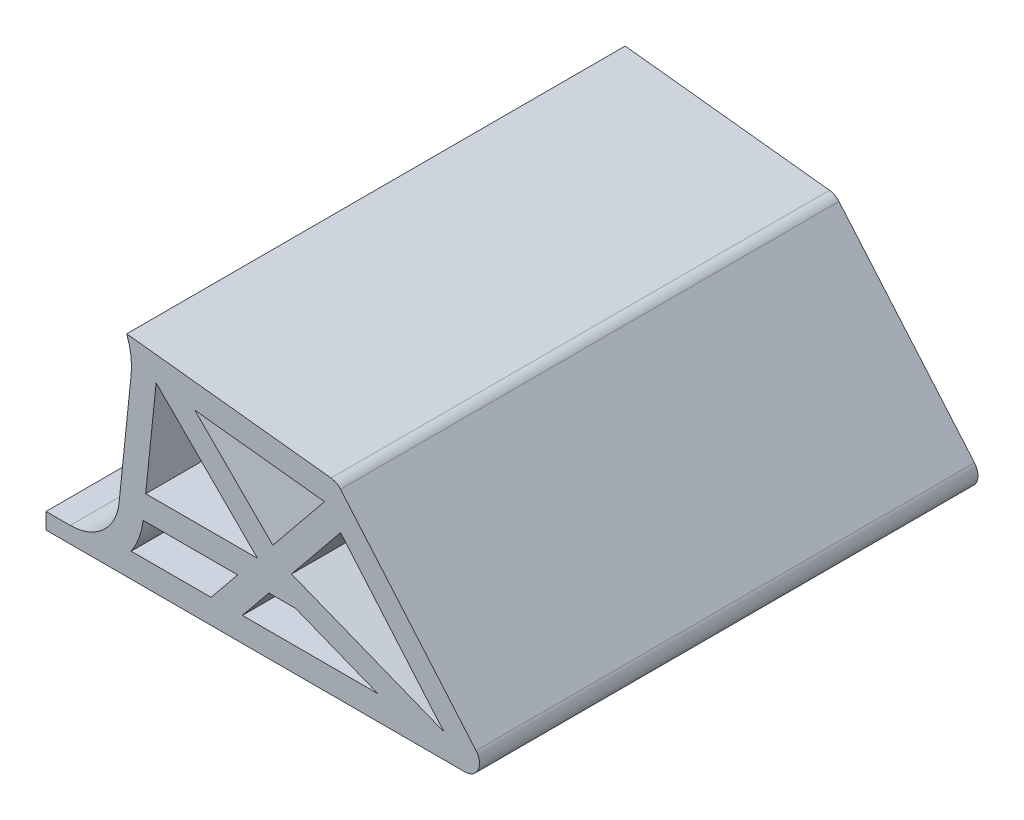
ISO-10303-21;
HEADER;
FILE_DESCRIPTION(('STEP AP214'),'2;1');
FILE_NAME('part.step','',(''),(''),'','','');
FILE_SCHEMA(('AUTOMOTIVE_DESIGN { 1 0 10303 214 1 1 1 1 }'));
ENDSEC;
DATA;
#1=APPLICATION_CONTEXT('core data for automotive mechanical design processes');
#2=APPLICATION_PROTOCOL_DEFINITION('international standard','automotive_design',2000,#1);
#3=PRODUCT_CONTEXT('',#1,'mechanical');
#4=PRODUCT('Part','Part','',(#3));
#5=PRODUCT_RELATED_PRODUCT_CATEGORY('part','',(#4));
#6=PRODUCT_DEFINITION_FORMATION('','',#4);
#7=PRODUCT_DEFINITION_CONTEXT('part definition',#1,'design');
#8=PRODUCT_DEFINITION('design','',#6,#7);
#9=PRODUCT_DEFINITION_SHAPE('','',#8);
#10=(LENGTH_UNIT() NAMED_UNIT(*) SI_UNIT(.MILLI.,.METRE.));
#11=(NAMED_UNIT(*) PLANE_ANGLE_UNIT() SI_UNIT($,.RADIAN.));
#12=(NAMED_UNIT(*) SI_UNIT($,.STERADIAN.) SOLID_ANGLE_UNIT());
#13=UNCERTAINTY_MEASURE_WITH_UNIT(LENGTH_MEASURE(1.E-05),#10,'distance_accuracy_value','');
#14=(GEOMETRIC_REPRESENTATION_CONTEXT(3) GLOBAL_UNCERTAINTY_ASSIGNED_CONTEXT((#13)) GLOBAL_UNIT_ASSIGNED_CONTEXT((#10,
#11,#12)) REPRESENTATION_CONTEXT('',''));
#15=CARTESIAN_POINT('',(0.,0.,0.));
#16=DIRECTION('',(0.,0.,1.));
#17=DIRECTION('',(1.,0.,0.));
#18=AXIS2_PLACEMENT_3D('',#15,#16,#17);
#19=CARTESIAN_POINT('',(65.028024959865,20.2989752880155,-51.31));
#20=DIRECTION('',(-0.994726056337949,0.102567406335303,0.));
#21=DIRECTION('',(-0.102567406335303,-0.994726056337949,0.));
#22=AXIS2_PLACEMENT_3D('',#19,#20,#21);
#23=PLANE('',#22);
#24=DIRECTION('',(0.,0.,1.));
#25=VECTOR('',#24,1.);
#26=CARTESIAN_POINT('',(62.8777569998753,-0.554896758997451,-51.31));
#27=LINE('',#26,#25);
#28=CARTESIAN_POINT('',(62.8777569998753,-0.554896758997451,-51.31));
#29=VERTEX_POINT('',#28);
#30=CARTESIAN_POINT('',(62.8777569998753,-0.55489675899745,51.31));
#31=VERTEX_POINT('',#30);
#32=EDGE_CURVE('E250',#29,#31,#27,.T.);
#33=ORIENTED_EDGE('',*,*,#32,.F.);
#34=DIRECTION('',(-0.102567406335303,-0.994726056337949,0.));
#35=VECTOR('',#34,1.);
#36=CARTESIAN_POINT('',(65.028024959865,20.2989752880155,-51.31));
#37=LINE('',#36,#35);
#38=CARTESIAN_POINT('',(65.028024959865,20.2989752880155,-51.31));
#39=VERTEX_POINT('',#38);
#40=EDGE_CURVE('E436',#39,#29,#37,.T.);
#41=ORIENTED_EDGE('',*,*,#40,.F.);
#42=DIRECTION('',(0.,0.,1.));
#43=VECTOR('',#42,1.);
#44=CARTESIAN_POINT('',(65.028024959865,20.2989752880155,-51.31));
#45=LINE('',#44,#43);
#46=CARTESIAN_POINT('',(65.028024959865,20.2989752880155,51.31));
#47=VERTEX_POINT('',#46);
#48=EDGE_CURVE('E419',#39,#47,#45,.T.);
#49=ORIENTED_EDGE('',*,*,#48,.T.);
#50=DIRECTION('',(-0.102567406335303,-0.994726056337949,0.));
#51=VECTOR('',#50,1.);
#52=CARTESIAN_POINT('',(65.028024959865,20.2989752880155,51.31));
#53=LINE('',#52,#51);
#54=EDGE_CURVE('E475',#47,#31,#53,.T.);
#55=ORIENTED_EDGE('',*,*,#54,.T.);
#56=EDGE_LOOP('',(#33,#41,#49,#55));
#57=FACE_BOUND('',#56,.T.);
#58=ADVANCED_FACE('F241',(#57),#23,.F.);
#59=CARTESIAN_POINT('',(59.8862344106623,-12.2938676792946,-51.31));
#60=DIRECTION('',(0.,-1.,0.));
#61=DIRECTION('',(1.,0.,0.));
#62=AXIS2_PLACEMENT_3D('',#59,#60,#61);
#63=PLANE('',#62);
#64=DIRECTION('',(0.,0.,-1.));
#65=VECTOR('',#64,1.);
#66=CARTESIAN_POINT('',(76.3374642279556,-12.2938676792946,99.4017159834064));
#67=LINE('',#66,#65);
#68=CARTESIAN_POINT('',(76.3374642279556,-12.2938676792946,51.31));
#69=VERTEX_POINT('',#68);
#70=CARTESIAN_POINT('',(76.3374642279556,-12.2938676792946,-51.31));
#71=VERTEX_POINT('',#70);
#72=EDGE_CURVE('E462',#69,#71,#67,.T.);
#73=ORIENTED_EDGE('',*,*,#72,.T.);
#74=DIRECTION('',(1.,0.,0.));
#75=VECTOR('',#74,1.);
#76=CARTESIAN_POINT('',(59.8862344106623,-12.2938676792946,-51.31));
#77=LINE('',#76,#75);
#78=CARTESIAN_POINT('',(59.8862344106623,-12.2938676792946,-51.31));
#79=VERTEX_POINT('',#78);
#80=EDGE_CURVE('E677',#79,#71,#77,.T.);
#81=ORIENTED_EDGE('',*,*,#80,.F.);
#82=DIRECTION('',(0.,0.,1.));
#83=VECTOR('',#82,1.);
#84=CARTESIAN_POINT('',(59.8862344106623,-12.2938676792946,-51.31));
#85=LINE('',#84,#83);
#86=CARTESIAN_POINT('',(59.8862344106623,-12.2938676792946,51.31));
#87=VERTEX_POINT('',#86);
#88=EDGE_CURVE('E445',#79,#87,#85,.T.);
#89=ORIENTED_EDGE('',*,*,#88,.T.);
#90=DIRECTION('',(1.,0.,0.));
#91=VECTOR('',#90,1.);
#92=CARTESIAN_POINT('',(59.8862344106623,-12.2938676792946,51.31));
#93=LINE('',#92,#91);
#94=EDGE_CURVE('E463',#87,#69,#93,.T.);
#95=ORIENTED_EDGE('',*,*,#94,.T.);
#96=EDGE_LOOP('',(#73,#81,#89,#95));
#97=FACE_BOUND('',#96,.T.);
#98=ADVANCED_FACE('F713',(#97),#63,.F.);
#99=CARTESIAN_POINT('',(47.3561523220938,-3.86729999999991,51.31));
#100=DIRECTION('',(0.,0.,-1.));
#101=DIRECTION('',(-1.,0.,0.));
#102=AXIS2_PLACEMENT_3D('',#99,#100,#101);
#103=CYLINDRICAL_SURFACE('',#102,10.1);
#104=CARTESIAN_POINT('',(47.3561523220938,-3.86729999999991,-51.31));
#105=DIRECTION('',(0.,0.,-1.));
#106=DIRECTION('',(1.,0.,0.));
#107=AXIS2_PLACEMENT_3D('',#104,#105,#106);
#108=CIRCLE('',#107,10.1);
#109=CARTESIAN_POINT('',(57.4028854911071,-4.90323080398647,-51.31));
#110=VERTEX_POINT('',#109);
#111=CARTESIAN_POINT('',(47.3561523220938,-13.9672999999999,-51.31));
#112=VERTEX_POINT('',#111);
#113=EDGE_CURVE('E429',#110,#112,#108,.T.);
#114=ORIENTED_EDGE('',*,*,#113,.T.);
#115=DIRECTION('',(0.,0.,-1.));
#116=VECTOR('',#115,1.);
#117=CARTESIAN_POINT('',(47.3561523220938,-13.9672999999999,51.31));
#118=LINE('',#117,#116);
#119=CARTESIAN_POINT('',(47.3561523220938,-13.9672999999999,51.31));
#120=VERTEX_POINT('',#119);
#121=EDGE_CURVE('E581',#120,#112,#118,.T.);
#122=ORIENTED_EDGE('',*,*,#121,.F.);
#123=CARTESIAN_POINT('',(47.3561523220938,-3.86729999999991,51.31));
#124=DIRECTION('',(0.,0.,-1.));
#125=DIRECTION('',(1.,0.,0.));
#126=AXIS2_PLACEMENT_3D('',#123,#124,#125);
#127=CIRCLE('',#126,10.1);
#128=CARTESIAN_POINT('',(57.4028854911071,-4.90323080398647,51.31));
#129=VERTEX_POINT('',#128);
#130=EDGE_CURVE('E484',#129,#120,#127,.T.);
#131=ORIENTED_EDGE('',*,*,#130,.F.);
#132=DIRECTION('',(0.,0.,-1.));
#133=VECTOR('',#132,1.);
#134=CARTESIAN_POINT('',(57.4028854911071,-4.90323080398647,51.31));
#135=LINE('',#134,#133);
#136=EDGE_CURVE('E516',#129,#110,#135,.T.);
#137=ORIENTED_EDGE('',*,*,#136,.T.);
#138=EDGE_LOOP('',(#114,#122,#131,#137));
#139=FACE_BOUND('',#138,.T.);
#140=ADVANCED_FACE('F243',(#139),#103,.F.);
#141=CARTESIAN_POINT('',(47.3561523220938,-13.9672999999999,51.31));
#142=DIRECTION('',(0.,-1.,0.));
#143=DIRECTION('',(0.,0.,-1.));
#144=AXIS2_PLACEMENT_3D('',#141,#142,#143);
#145=PLANE('',#144);
#146=DIRECTION('',(-1.,0.,0.));
#147=VECTOR('',#146,1.);
#148=CARTESIAN_POINT('',(47.3561523220938,-13.9672999999999,-51.31));
#149=LINE('',#148,#147);
#150=CARTESIAN_POINT('',(42.3561523220938,-13.9672999999999,-51.31));
#151=VERTEX_POINT('',#150);
#152=EDGE_CURVE('E520',#112,#151,#149,.T.);
#153=ORIENTED_EDGE('',*,*,#152,.T.);
#154=DIRECTION('',(0.,0.,-1.));
#155=VECTOR('',#154,1.);
#156=CARTESIAN_POINT('',(42.3561523220938,-13.9672999999999,51.31));
#157=LINE('',#156,#155);
#158=CARTESIAN_POINT('',(42.3561523220938,-13.9672999999999,51.31));
#159=VERTEX_POINT('',#158);
#160=EDGE_CURVE('E577',#159,#151,#157,.T.);
#161=ORIENTED_EDGE('',*,*,#160,.F.);
#162=DIRECTION('',(-1.,0.,0.));
#163=VECTOR('',#162,1.);
#164=CARTESIAN_POINT('',(47.3561523220938,-13.9672999999999,51.31));
#165=LINE('',#164,#163);
#166=EDGE_CURVE('E488',#120,#159,#165,.T.);
#167=ORIENTED_EDGE('',*,*,#166,.F.);
#168=ORIENTED_EDGE('',*,*,#121,.T.);
#169=EDGE_LOOP('',(#153,#161,#167,#168));
#170=FACE_BOUND('',#169,.T.);
#171=ADVANCED_FACE('F771',(#170),#145,.F.);
#172=CARTESIAN_POINT('',(42.3561523220938,-17.2938676792946,51.31));
#173=DIRECTION('',(1.,0.,0.));
#174=DIRECTION('',(0.,0.,-1.));
#175=AXIS2_PLACEMENT_3D('',#172,#173,#174);
#176=PLANE('',#175);
#177=DIRECTION('',(0.,-1.,0.));
#178=VECTOR('',#177,1.);
#179=CARTESIAN_POINT('',(42.3561523220938,-17.2938676792946,-51.31));
#180=LINE('',#179,#178);
#181=CARTESIAN_POINT('',(42.3561523220938,-17.2938676792946,-51.31));
#182=VERTEX_POINT('',#181);
#183=EDGE_CURVE('E523',#151,#182,#180,.T.);
#184=ORIENTED_EDGE('',*,*,#183,.T.);
#185=DIRECTION('',(0.,0.,-1.));
#186=VECTOR('',#185,1.);
#187=CARTESIAN_POINT('',(42.3561523220938,-17.2938676792946,51.31));
#188=LINE('',#187,#186);
#189=CARTESIAN_POINT('',(42.3561523220938,-17.2938676792946,51.31));
#190=VERTEX_POINT('',#189);
#191=EDGE_CURVE('E573',#190,#182,#188,.T.);
#192=ORIENTED_EDGE('',*,*,#191,.F.);
#193=DIRECTION('',(0.,-1.,0.));
#194=VECTOR('',#193,1.);
#195=CARTESIAN_POINT('',(42.3561523220938,-17.2938676792946,51.31));
#196=LINE('',#195,#194);
#197=EDGE_CURVE('E492',#159,#190,#196,.T.);
#198=ORIENTED_EDGE('',*,*,#197,.F.);
#199=ORIENTED_EDGE('',*,*,#160,.T.);
#200=EDGE_LOOP('',(#184,#192,#198,#199));
#201=FACE_BOUND('',#200,.T.);
#202=ADVANCED_FACE('F768',(#201),#176,.F.);
#203=CARTESIAN_POINT('',(42.3561523220938,-17.2938676792946,51.31));
#204=DIRECTION('',(0.,1.,0.));
#205=DIRECTION('',(0.,0.,1.));
#206=AXIS2_PLACEMENT_3D('',#203,#204,#205);
#207=PLANE('',#206);
#208=DIRECTION('',(1.,0.,0.));
#209=VECTOR('',#208,1.);
#210=CARTESIAN_POINT('',(42.3561523220938,-17.2938676792946,-51.31));
#211=LINE('',#210,#209);
#212=CARTESIAN_POINT('',(128.611229128184,-17.2938676792946,-51.31));
#213=VERTEX_POINT('',#212);
#214=EDGE_CURVE('E526',#182,#213,#211,.T.);
#215=ORIENTED_EDGE('',*,*,#214,.T.);
#216=DIRECTION('',(0.,0.,-1.));
#217=VECTOR('',#216,1.);
#218=CARTESIAN_POINT('',(128.611229128184,-17.2938676792946,51.31));
#219=LINE('',#218,#217);
#220=CARTESIAN_POINT('',(128.611229128184,-17.2938676792946,51.31));
#221=VERTEX_POINT('',#220);
#222=EDGE_CURVE('E569',#221,#213,#219,.T.);
#223=ORIENTED_EDGE('',*,*,#222,.F.);
#224=DIRECTION('',(1.,0.,0.));
#225=VECTOR('',#224,1.);
#226=CARTESIAN_POINT('',(42.3561523220938,-17.2938676792946,51.31));
#227=LINE('',#226,#225);
#228=EDGE_CURVE('E495',#190,#221,#227,.T.);
#229=ORIENTED_EDGE('',*,*,#228,.F.);
#230=ORIENTED_EDGE('',*,*,#191,.T.);
#231=EDGE_LOOP('',(#215,#223,#229,#230));
#232=FACE_BOUND('',#231,.T.);
#233=ADVANCED_FACE('F764',(#232),#207,.F.);
#234=CARTESIAN_POINT('',(128.611229128184,-14.2938676792946,51.31));
#235=DIRECTION('',(0.,0.,-1.));
#236=DIRECTION('',(-1.,0.,0.));
#237=AXIS2_PLACEMENT_3D('',#234,#235,#236);
#238=CYLINDRICAL_SURFACE('',#237,3.);
#239=CARTESIAN_POINT('',(128.611229128184,-14.2938676792946,-51.31));
#240=DIRECTION('',(0.,0.,1.));
#241=DIRECTION('',(1.,0.,0.));
#242=AXIS2_PLACEMENT_3D('',#239,#240,#241);
#243=CIRCLE('',#242,3.);
#244=CARTESIAN_POINT('',(130.891584134114,-12.3445136716982,-51.31));
#245=VERTEX_POINT('',#244);
#246=EDGE_CURVE('E529',#213,#245,#243,.T.);
#247=ORIENTED_EDGE('',*,*,#246,.T.);
#248=DIRECTION('',(0.,0.,-1.));
#249=VECTOR('',#248,1.);
#250=CARTESIAN_POINT('',(130.891584134114,-12.3445136716982,51.31));
#251=LINE('',#250,#249);
#252=CARTESIAN_POINT('',(130.891584134114,-12.3445136716982,51.31));
#253=VERTEX_POINT('',#252);
#254=EDGE_CURVE('E565',#253,#245,#251,.T.);
#255=ORIENTED_EDGE('',*,*,#254,.F.);
#256=CARTESIAN_POINT('',(128.611229128184,-14.2938676792946,51.31));
#257=DIRECTION('',(0.,0.,1.));
#258=DIRECTION('',(1.,0.,0.));
#259=AXIS2_PLACEMENT_3D('',#256,#257,#258);
#260=CIRCLE('',#259,3.);
#261=EDGE_CURVE('E498',#221,#253,#260,.T.);
#262=ORIENTED_EDGE('',*,*,#261,.F.);
#263=ORIENTED_EDGE('',*,*,#222,.T.);
#264=EDGE_LOOP('',(#247,#255,#262,#263));
#265=FACE_BOUND('',#264,.T.);
#266=ADVANCED_FACE('F760',(#265),#238,.T.);
#267=CARTESIAN_POINT('',(130.891584134114,-12.3445136716982,51.31));
#268=DIRECTION('',(-0.760118335309846,-0.649784669198795,0.));
#269=DIRECTION('',(0.649784669198795,-0.760118335309847,0.));
#270=AXIS2_PLACEMENT_3D('',#267,#268,#269);
#271=PLANE('',#270);
#272=DIRECTION('',(-0.649784669198795,0.760118335309846,0.));
#273=VECTOR('',#272,1.);
#274=CARTESIAN_POINT('',(130.891584134114,-12.3445136716982,-51.31));
#275=LINE('',#274,#273);
#276=CARTESIAN_POINT('',(102.99035500593,20.2943540075963,-51.31));
#277=VERTEX_POINT('',#276);
#278=EDGE_CURVE('E532',#245,#277,#275,.T.);
#279=ORIENTED_EDGE('',*,*,#278,.T.);
#280=DIRECTION('',(0.,0.,-1.));
#281=VECTOR('',#280,1.);
#282=CARTESIAN_POINT('',(102.99035500593,20.2943540075963,51.31));
#283=LINE('',#282,#281);
#284=CARTESIAN_POINT('',(102.99035500593,20.2943540075963,51.31));
#285=VERTEX_POINT('',#284);
#286=EDGE_CURVE('E561',#285,#277,#283,.T.);
#287=ORIENTED_EDGE('',*,*,#286,.F.);
#288=DIRECTION('',(-0.649784669198795,0.760118335309846,0.));
#289=VECTOR('',#288,1.);
#290=CARTESIAN_POINT('',(130.891584134114,-12.3445136716982,51.31));
#291=LINE('',#290,#289);
#292=EDGE_CURVE('E501',#253,#285,#291,.T.);
#293=ORIENTED_EDGE('',*,*,#292,.F.);
#294=ORIENTED_EDGE('',*,*,#254,.T.);
#295=EDGE_LOOP('',(#279,#287,#293,#294));
#296=FACE_BOUND('',#295,.T.);
#297=ADVANCED_FACE('F756',(#296),#271,.F.);
#298=CARTESIAN_POINT('',(100.71,18.345,51.31));
#299=DIRECTION('',(0.,0.,-1.));
#300=DIRECTION('',(-1.,0.,0.));
#301=AXIS2_PLACEMENT_3D('',#298,#299,#300);
#302=CYLINDRICAL_SURFACE('',#301,3.00000000000006);
#303=CARTESIAN_POINT('',(100.71,18.345,-51.31));
#304=DIRECTION('',(0.,0.,1.));
#305=DIRECTION('',(1.,0.,0.));
#306=AXIS2_PLACEMENT_3D('',#303,#304,#305);
#307=CIRCLE('',#306,3.00000000000006);
#308=CARTESIAN_POINT('',(101.041429063357,21.3266362581579,-51.31));
#309=VERTEX_POINT('',#308);
#310=EDGE_CURVE('E535',#277,#309,#307,.T.);
#311=ORIENTED_EDGE('',*,*,#310,.T.);
#312=DIRECTION('',(0.,0.,-1.));
#313=VECTOR('',#312,1.);
#314=CARTESIAN_POINT('',(101.041429063357,21.3266362581579,51.31));
#315=LINE('',#314,#313);
#316=CARTESIAN_POINT('',(101.041429063357,21.3266362581579,51.31));
#317=VERTEX_POINT('',#316);
#318=EDGE_CURVE('E557',#317,#309,#315,.T.);
#319=ORIENTED_EDGE('',*,*,#318,.F.);
#320=CARTESIAN_POINT('',(100.71,18.345,51.31));
#321=DIRECTION('',(0.,0.,1.));
#322=DIRECTION('',(1.,0.,0.));
#323=AXIS2_PLACEMENT_3D('',#320,#321,#322);
#324=CIRCLE('',#323,3.00000000000006);
#325=EDGE_CURVE('E504',#285,#317,#324,.T.);
#326=ORIENTED_EDGE('',*,*,#325,.F.);
#327=ORIENTED_EDGE('',*,*,#286,.T.);
#328=EDGE_LOOP('',(#311,#319,#326,#327));
#329=FACE_BOUND('',#328,.T.);
#330=ADVANCED_FACE('F752',(#329),#302,.T.);
#331=CARTESIAN_POINT('',(58.9698937655127,26.003172337842,51.31));
#332=DIRECTION('',(-0.110476354452445,-0.993878752719313,0.));
#333=DIRECTION('',(0.993878752719313,-0.110476354452445,0.));
#334=AXIS2_PLACEMENT_3D('',#331,#332,#333);
#335=PLANE('',#334);
#336=DIRECTION('',(-0.993878752719313,0.110476354452445,0.));
#337=VECTOR('',#336,1.);
#338=CARTESIAN_POINT('',(58.9698937655127,26.003172337842,-51.31));
#339=LINE('',#338,#337);
#340=CARTESIAN_POINT('',(58.9698937655127,26.003172337842,-51.31));
#341=VERTEX_POINT('',#340);
#342=EDGE_CURVE('E538',#309,#341,#339,.T.);
#343=ORIENTED_EDGE('',*,*,#342,.T.);
#344=DIRECTION('',(0.,0.,-1.));
#345=VECTOR('',#344,1.);
#346=CARTESIAN_POINT('',(58.9698937655127,26.003172337842,51.31));
#347=LINE('',#346,#345);
#348=CARTESIAN_POINT('',(58.9698937655127,26.003172337842,51.31));
#349=VERTEX_POINT('',#348);
#350=EDGE_CURVE('E553',#349,#341,#347,.T.);
#351=ORIENTED_EDGE('',*,*,#350,.F.);
#352=DIRECTION('',(-0.993878752719313,0.110476354452445,0.));
#353=VECTOR('',#352,1.);
#354=CARTESIAN_POINT('',(58.9698937655127,26.003172337842,51.31));
#355=LINE('',#354,#353);
#356=EDGE_CURVE('E507',#317,#349,#355,.T.);
#357=ORIENTED_EDGE('',*,*,#356,.F.);
#358=ORIENTED_EDGE('',*,*,#318,.T.);
#359=EDGE_LOOP('',(#343,#351,#357,#358));
#360=FACE_BOUND('',#359,.T.);
#361=ADVANCED_FACE('F748',(#360),#335,.F.);
#362=CARTESIAN_POINT('',(44.8561523220938,20.6354630994126,51.31));
#363=DIRECTION('',(0.,0.,-1.));
#364=DIRECTION('',(-1.,0.,0.));
#365=AXIS2_PLACEMENT_3D('',#362,#363,#364);
#366=CYLINDRICAL_SURFACE('',#365,15.1);
#367=CARTESIAN_POINT('',(44.8561523220938,20.6354630994126,-51.31));
#368=DIRECTION('',(0.,0.,-1.));
#369=DIRECTION('',(1.,0.,0.));
#370=AXIS2_PLACEMENT_3D('',#367,#368,#369);
#371=CIRCLE('',#370,15.1);
#372=CARTESIAN_POINT('',(59.8765157727968,19.0866952637495,-51.31));
#373=VERTEX_POINT('',#372);
#374=EDGE_CURVE('E541',#341,#373,#371,.T.);
#375=ORIENTED_EDGE('',*,*,#374,.T.);
#376=DIRECTION('',(0.,0.,-1.));
#377=VECTOR('',#376,1.);
#378=CARTESIAN_POINT('',(59.8765157727968,19.0866952637495,51.31));
#379=LINE('',#378,#377);
#380=CARTESIAN_POINT('',(59.8765157727968,19.0866952637495,51.31));
#381=VERTEX_POINT('',#380);
#382=EDGE_CURVE('E549',#381,#373,#379,.T.);
#383=ORIENTED_EDGE('',*,*,#382,.F.);
#384=CARTESIAN_POINT('',(44.8561523220938,20.6354630994126,51.31));
#385=DIRECTION('',(0.,0.,-1.));
#386=DIRECTION('',(1.,0.,0.));
#387=AXIS2_PLACEMENT_3D('',#384,#385,#386);
#388=CIRCLE('',#387,15.1);
#389=EDGE_CURVE('E510',#349,#381,#388,.T.);
#390=ORIENTED_EDGE('',*,*,#389,.F.);
#391=ORIENTED_EDGE('',*,*,#350,.T.);
#392=EDGE_LOOP('',(#375,#383,#390,#391));
#393=FACE_BOUND('',#392,.T.);
#394=ADVANCED_FACE('F744',(#393),#366,.F.);
#395=CARTESIAN_POINT('',(59.8765157727968,19.0866952637495,51.31));
#396=DIRECTION('',(0.994726056337949,-0.102567406335303,0.));
#397=DIRECTION('',(0.102567406335303,0.994726056337949,0.));
#398=AXIS2_PLACEMENT_3D('',#395,#396,#397);
#399=PLANE('',#398);
#400=DIRECTION('',(-0.102567406335303,-0.994726056337949,0.));
#401=VECTOR('',#400,1.);
#402=CARTESIAN_POINT('',(59.8765157727968,19.0866952637495,-51.31));
#403=LINE('',#402,#401);
#404=EDGE_CURVE('E489',#373,#110,#403,.T.);
#405=ORIENTED_EDGE('',*,*,#404,.T.);
#406=ORIENTED_EDGE('',*,*,#136,.F.);
#407=DIRECTION('',(-0.102567406335303,-0.994726056337949,0.));
#408=VECTOR('',#407,1.);
#409=CARTESIAN_POINT('',(59.8765157727968,19.0866952637495,51.31));
#410=LINE('',#409,#408);
#411=EDGE_CURVE('E513',#381,#129,#410,.T.);
#412=ORIENTED_EDGE('',*,*,#411,.F.);
#413=ORIENTED_EDGE('',*,*,#382,.T.);
#414=EDGE_LOOP('',(#405,#406,#412,#413));
#415=FACE_BOUND('',#414,.T.);
#416=ADVANCED_FACE('F738',(#415),#399,.F.);
#417=CARTESIAN_POINT('',(47.3561523220938,-3.86729999999991,51.31));
#418=DIRECTION('',(0.,0.,1.));
#419=DIRECTION('',(1.,0.,0.));
#420=AXIS2_PLACEMENT_3D('',#417,#418,#419);
#421=PLANE('',#420);
#422=DIRECTION('',(-0.993878752719313,0.110476354452444,0.));
#423=VECTOR('',#422,1.);
#424=CARTESIAN_POINT('',(99.703405470466,16.4445719037182,51.31));
#425=LINE('',#424,#423);
#426=CARTESIAN_POINT('',(99.703405470466,16.4445719037182,51.31));
#427=VERTEX_POINT('',#426);
#428=CARTESIAN_POINT('',(72.9833849079909,19.4146831517552,51.31));
#429=VERTEX_POINT('',#428);
#430=EDGE_CURVE('E471',#427,#429,#425,.T.);
#431=ORIENTED_EDGE('',*,*,#430,.F.);
#432=DIRECTION('',(-0.630852129186937,-0.775903080996788,0.));
#433=VECTOR('',#432,1.);
#434=CARTESIAN_POINT('',(99.703405470466,16.4445719037182,51.31));
#435=LINE('',#434,#433);
#436=CARTESIAN_POINT('',(89.0528809509564,3.34518710879011,51.31));
#437=VERTEX_POINT('',#436);
#438=EDGE_CURVE('E663',#427,#437,#435,.T.);
#439=ORIENTED_EDGE('',*,*,#438,.T.);
#440=DIRECTION('',(0.707106781186556,-0.707106781186539,0.));
#441=VECTOR('',#440,1.);
#442=CARTESIAN_POINT('',(68.5635588657977,23.8345091939483,51.31));
#443=LINE('',#442,#441);
#444=EDGE_CURVE('E624',#429,#437,#443,.T.);
#445=ORIENTED_EDGE('',*,*,#444,.F.);
#446=EDGE_LOOP('',(#431,#439,#445));
#447=FACE_BOUND('',#446,.T.);
#448=CARTESIAN_POINT('',(82.7815680373858,-12.2938676792946,51.31));
#449=VERTEX_POINT('',#448);
#450=CARTESIAN_POINT('',(110.701780122167,-12.2938676792946,51.31));
#451=VERTEX_POINT('',#450);
#452=EDGE_CURVE('E461',#449,#451,#93,.T.);
#453=ORIENTED_EDGE('',*,*,#452,.F.);
#454=DIRECTION('',(-0.630852129186937,-0.775903080996788,0.));
#455=VECTOR('',#454,1.);
#456=CARTESIAN_POINT('',(103.58292087545,13.2903112577835,51.31));
#457=LINE('',#456,#455);
#458=CARTESIAN_POINT('',(88.260724207428,-5.55489675899745,51.31));
#459=VERTEX_POINT('',#458);
#460=EDGE_CURVE('E667',#459,#449,#457,.T.);
#461=ORIENTED_EDGE('',*,*,#460,.F.);
#462=DIRECTION('',(-1.,0.,0.));
#463=VECTOR('',#462,1.);
#464=CARTESIAN_POINT('',(85.8818970068785,-5.55489675899745,51.31));
#465=LINE('',#464,#463);
#466=CARTESIAN_POINT('',(93.7010495162163,-5.55489675899743,51.31));
#467=VERTEX_POINT('',#466);
#468=EDGE_CURVE('E621',#467,#459,#465,.T.);
#469=ORIENTED_EDGE('',*,*,#468,.F.);
#470=DIRECTION('',(-0.92962845066077,0.368498227569763,0.));
#471=VECTOR('',#470,1.);
#472=CARTESIAN_POINT('',(122.427875278409,-16.9420099325984,51.31));
#473=LINE('',#472,#471);
#474=EDGE_CURVE('E635',#451,#467,#473,.T.);
#475=ORIENTED_EDGE('',*,*,#474,.F.);
#476=EDGE_LOOP('',(#453,#461,#469,#475));
#477=FACE_BOUND('',#476,.T.);
#478=DIRECTION('',(-1.,0.,0.));
#479=VECTOR('',#478,1.);
#480=CARTESIAN_POINT('',(85.8818970068785,-0.554896758997447,51.31));
#481=LINE('',#480,#479);
#482=CARTESIAN_POINT('',(85.8818970068785,-0.554896758997447,51.31));
#483=VERTEX_POINT('',#482);
#484=EDGE_CURVE('E605',#483,#31,#481,.T.);
#485=ORIENTED_EDGE('',*,*,#484,.T.);
#486=ORIENTED_EDGE('',*,*,#54,.F.);
#487=DIRECTION('',(0.707106781186556,-0.707106781186539,0.));
#488=VECTOR('',#487,1.);
#489=CARTESIAN_POINT('',(65.028024959865,20.2989752880155,51.31));
#490=LINE('',#489,#488);
#491=EDGE_CURVE('E424',#47,#483,#490,.T.);
#492=ORIENTED_EDGE('',*,*,#491,.T.);
#493=EDGE_LOOP('',(#485,#486,#492));
#494=FACE_BOUND('',#493,.T.);
#495=CARTESIAN_POINT('',(47.3561523220938,-3.86729999999991,51.31));
#496=DIRECTION('',(0.,0.,-1.));
#497=DIRECTION('',(1.,0.,0.));
#498=AXIS2_PLACEMENT_3D('',#495,#496,#497);
#499=CIRCLE('',#498,15.1);
#500=CARTESIAN_POINT('',(62.3615519228715,-5.55489675899745,51.31));
#501=VERTEX_POINT('',#500);
#502=EDGE_CURVE('E458',#501,#87,#499,.T.);
#503=ORIENTED_EDGE('',*,*,#502,.F.);
#504=CARTESIAN_POINT('',(81.8166203979978,-5.55489675899745,51.31));
#505=VERTEX_POINT('',#504);
#506=EDGE_CURVE('E1035',#505,#501,#465,.T.);
#507=ORIENTED_EDGE('',*,*,#506,.F.);
#508=EDGE_CURVE('E662',#505,#69,#435,.T.);
#509=ORIENTED_EDGE('',*,*,#508,.T.);
#510=ORIENTED_EDGE('',*,*,#94,.F.);
#511=EDGE_LOOP('',(#503,#507,#509,#510));
#512=FACE_BOUND('',#511,.T.);
#513=DIRECTION('',(-0.649784669198796,0.760118335309846,0.));
#514=VECTOR('',#513,1.);
#515=CARTESIAN_POINT('',(124.270366416258,-12.2938676792946,51.31));
#516=LINE('',#515,#514);
#517=CARTESIAN_POINT('',(124.270366416258,-12.2938676792946,51.31));
#518=VERTEX_POINT('',#517);
#519=CARTESIAN_POINT('',(103.006189975251,12.5809734246099,51.31));
#520=VERTEX_POINT('',#519);
#521=EDGE_CURVE('E467',#518,#520,#516,.T.);
#522=ORIENTED_EDGE('',*,*,#521,.F.);
#523=DIRECTION('',(-0.92962845066077,0.368498227569763,0.));
#524=VECTOR('',#523,1.);
#525=CARTESIAN_POINT('',(124.270366416258,-12.2938676792946,51.31));
#526=LINE('',#525,#524);
#527=CARTESIAN_POINT('',(92.8938790063184,0.143552872657668,51.31));
#528=VERTEX_POINT('',#527);
#529=EDGE_CURVE('E631',#518,#528,#526,.T.);
#530=ORIENTED_EDGE('',*,*,#529,.T.);
#531=EDGE_CURVE('E668',#520,#528,#457,.T.);
#532=ORIENTED_EDGE('',*,*,#531,.F.);
#533=EDGE_LOOP('',(#522,#530,#532));
#534=FACE_BOUND('',#533,.T.);
#535=ORIENTED_EDGE('',*,*,#130,.T.);
#536=ORIENTED_EDGE('',*,*,#166,.T.);
#537=ORIENTED_EDGE('',*,*,#197,.T.);
#538=ORIENTED_EDGE('',*,*,#228,.T.);
#539=ORIENTED_EDGE('',*,*,#261,.T.);
#540=ORIENTED_EDGE('',*,*,#292,.T.);
#541=ORIENTED_EDGE('',*,*,#325,.T.);
#542=ORIENTED_EDGE('',*,*,#356,.T.);
#543=ORIENTED_EDGE('',*,*,#389,.T.);
#544=ORIENTED_EDGE('',*,*,#411,.T.);
#545=EDGE_LOOP('',(#535,#536,#537,#538,#539,#540,#541,#542,#543,#544));
#546=FACE_BOUND('',#545,.T.);
#547=ADVANCED_FACE('F607',(#447,#477,#494,#512,#534,#546),#421,.T.);
#548=CARTESIAN_POINT('',(47.3561523220938,-3.86729999999991,-51.31));
#549=DIRECTION('',(0.,0.,1.));
#550=DIRECTION('',(1.,0.,0.));
#551=AXIS2_PLACEMENT_3D('',#548,#549,#550);
#552=PLANE('',#551);
#553=DIRECTION('',(0.630852129186937,0.775903080996788,0.));
#554=VECTOR('',#553,1.);
#555=CARTESIAN_POINT('',(99.703405470466,16.4445719037182,-51.31));
#556=LINE('',#555,#554);
#557=CARTESIAN_POINT('',(89.0528809509564,3.3451871087901,-51.31));
#558=VERTEX_POINT('',#557);
#559=CARTESIAN_POINT('',(99.703405470466,16.4445719037182,-51.31));
#560=VERTEX_POINT('',#559);
#561=EDGE_CURVE('E657',#558,#560,#556,.T.);
#562=ORIENTED_EDGE('',*,*,#561,.T.);
#563=DIRECTION('',(-0.993878752719313,0.110476354452444,0.));
#564=VECTOR('',#563,1.);
#565=CARTESIAN_POINT('',(99.703405470466,16.4445719037182,-51.31));
#566=LINE('',#565,#564);
#567=CARTESIAN_POINT('',(72.9833849079909,19.4146831517552,-51.31));
#568=VERTEX_POINT('',#567);
#569=EDGE_CURVE('E446',#560,#568,#566,.T.);
#570=ORIENTED_EDGE('',*,*,#569,.T.);
#571=DIRECTION('',(-0.707106781186556,0.707106781186539,0.));
#572=VECTOR('',#571,1.);
#573=CARTESIAN_POINT('',(68.5635588657977,23.8345091939483,-51.31));
#574=LINE('',#573,#572);
#575=EDGE_CURVE('E441',#558,#568,#574,.T.);
#576=ORIENTED_EDGE('',*,*,#575,.F.);
#577=EDGE_LOOP('',(#562,#570,#576));
#578=FACE_BOUND('',#577,.T.);
#579=DIRECTION('',(0.630852129186937,0.775903080996788,0.));
#580=VECTOR('',#579,1.);
#581=CARTESIAN_POINT('',(103.58292087545,13.2903112577835,-51.31));
#582=LINE('',#581,#580);
#583=CARTESIAN_POINT('',(82.7815680373858,-12.2938676792946,-51.31));
#584=VERTEX_POINT('',#583);
#585=CARTESIAN_POINT('',(88.260724207428,-5.55489675899745,-51.31));
#586=VERTEX_POINT('',#585);
#587=EDGE_CURVE('E654',#584,#586,#582,.T.);
#588=ORIENTED_EDGE('',*,*,#587,.F.);
#589=CARTESIAN_POINT('',(110.701780122167,-12.2938676792946,-51.31));
#590=VERTEX_POINT('',#589);
#591=EDGE_CURVE('E676',#584,#590,#77,.T.);
#592=ORIENTED_EDGE('',*,*,#591,.T.);
#593=DIRECTION('',(0.92962845066077,-0.368498227569763,0.));
#594=VECTOR('',#593,1.);
#595=CARTESIAN_POINT('',(122.427875278409,-16.9420099325984,-51.31));
#596=LINE('',#595,#594);
#597=CARTESIAN_POINT('',(93.7010495162164,-5.55489675899745,-51.31));
#598=VERTEX_POINT('',#597);
#599=EDGE_CURVE('E615',#598,#590,#596,.T.);
#600=ORIENTED_EDGE('',*,*,#599,.F.);
#601=DIRECTION('',(1.,0.,0.));
#602=VECTOR('',#601,1.);
#603=CARTESIAN_POINT('',(85.8818970068785,-5.55489675899745,-51.31));
#604=LINE('',#603,#602);
#605=EDGE_CURVE('E1043',#586,#598,#604,.T.);
#606=ORIENTED_EDGE('',*,*,#605,.F.);
#607=EDGE_LOOP('',(#588,#592,#600,#606));
#608=FACE_BOUND('',#607,.T.);
#609=ORIENTED_EDGE('',*,*,#40,.T.);
#610=DIRECTION('',(1.,0.,0.));
#611=VECTOR('',#610,1.);
#612=CARTESIAN_POINT('',(85.8818970068785,-0.554896758997447,-51.31));
#613=LINE('',#612,#611);
#614=CARTESIAN_POINT('',(85.8818970068785,-0.554896758997447,-51.31));
#615=VERTEX_POINT('',#614);
#616=EDGE_CURVE('E438',#29,#615,#613,.T.);
#617=ORIENTED_EDGE('',*,*,#616,.T.);
#618=DIRECTION('',(-0.707106781186556,0.707106781186539,0.));
#619=VECTOR('',#618,1.);
#620=CARTESIAN_POINT('',(65.028024959865,20.2989752880155,-51.31));
#621=LINE('',#620,#619);
#622=EDGE_CURVE('E422',#615,#39,#621,.T.);
#623=ORIENTED_EDGE('',*,*,#622,.T.);
#624=EDGE_LOOP('',(#609,#617,#623));
#625=FACE_BOUND('',#624,.T.);
#626=CARTESIAN_POINT('',(62.3615519228715,-5.55489675899745,-51.31));
#627=VERTEX_POINT('',#626);
#628=CARTESIAN_POINT('',(81.8166203979978,-5.55489675899745,-51.31));
#629=VERTEX_POINT('',#628);
#630=EDGE_CURVE('E1041',#627,#629,#604,.T.);
#631=ORIENTED_EDGE('',*,*,#630,.F.);
#632=CARTESIAN_POINT('',(47.3561523220938,-3.86729999999991,-51.31));
#633=DIRECTION('',(0.,0.,-1.));
#634=DIRECTION('',(1.,0.,0.));
#635=AXIS2_PLACEMENT_3D('',#632,#633,#634);
#636=CIRCLE('',#635,15.1);
#637=EDGE_CURVE('E256',#627,#79,#636,.T.);
#638=ORIENTED_EDGE('',*,*,#637,.T.);
#639=ORIENTED_EDGE('',*,*,#80,.T.);
#640=EDGE_CURVE('E658',#71,#629,#556,.T.);
#641=ORIENTED_EDGE('',*,*,#640,.T.);
#642=EDGE_LOOP('',(#631,#638,#639,#641));
#643=FACE_BOUND('',#642,.T.);
#644=DIRECTION('',(0.92962845066077,-0.368498227569763,0.));
#645=VECTOR('',#644,1.);
#646=CARTESIAN_POINT('',(124.270366416258,-12.2938676792946,-51.31));
#647=LINE('',#646,#645);
#648=CARTESIAN_POINT('',(92.8938790063184,0.143552872657667,-51.31));
#649=VERTEX_POINT('',#648);
#650=CARTESIAN_POINT('',(124.270366416258,-12.2938676792946,-51.31));
#651=VERTEX_POINT('',#650);
#652=EDGE_CURVE('E628',#649,#651,#647,.T.);
#653=ORIENTED_EDGE('',*,*,#652,.T.);
#654=DIRECTION('',(-0.649784669198796,0.760118335309846,0.));
#655=VECTOR('',#654,1.);
#656=CARTESIAN_POINT('',(124.270366416258,-12.2938676792946,-51.31));
#657=LINE('',#656,#655);
#658=CARTESIAN_POINT('',(103.006189975251,12.5809734246099,-51.31));
#659=VERTEX_POINT('',#658);
#660=EDGE_CURVE('E454',#651,#659,#657,.T.);
#661=ORIENTED_EDGE('',*,*,#660,.T.);
#662=EDGE_CURVE('E653',#649,#659,#582,.T.);
#663=ORIENTED_EDGE('',*,*,#662,.F.);
#664=EDGE_LOOP('',(#653,#661,#663));
#665=FACE_BOUND('',#664,.T.);
#666=ORIENTED_EDGE('',*,*,#113,.F.);
#667=ORIENTED_EDGE('',*,*,#404,.F.);
#668=ORIENTED_EDGE('',*,*,#374,.F.);
#669=ORIENTED_EDGE('',*,*,#342,.F.);
#670=ORIENTED_EDGE('',*,*,#310,.F.);
#671=ORIENTED_EDGE('',*,*,#278,.F.);
#672=ORIENTED_EDGE('',*,*,#246,.F.);
#673=ORIENTED_EDGE('',*,*,#214,.F.);
#674=ORIENTED_EDGE('',*,*,#183,.F.);
#675=ORIENTED_EDGE('',*,*,#152,.F.);
#676=EDGE_LOOP('',(#666,#667,#668,#669,#670,#671,#672,#673,#674,#675));
#677=FACE_BOUND('',#676,.T.);
#678=ADVANCED_FACE('F434',(#578,#608,#625,#643,#665,#677),#552,.F.);
#679=CARTESIAN_POINT('',(47.3561523220938,-3.86729999999991,-51.31));
#680=DIRECTION('',(0.,0.,1.));
#681=DIRECTION('',(1.,0.,0.));
#682=AXIS2_PLACEMENT_3D('',#679,#680,#681);
#683=CYLINDRICAL_SURFACE('',#682,15.1);
#684=ORIENTED_EDGE('',*,*,#637,.F.);
#685=DIRECTION('',(0.,0.,1.));
#686=VECTOR('',#685,1.);
#687=CARTESIAN_POINT('',(62.3615519228715,-5.55489675899745,-51.31));
#688=LINE('',#687,#686);
#689=EDGE_CURVE('E12',#627,#501,#688,.T.);
#690=ORIENTED_EDGE('',*,*,#689,.T.);
#691=ORIENTED_EDGE('',*,*,#502,.T.);
#692=ORIENTED_EDGE('',*,*,#88,.F.);
#693=EDGE_LOOP('',(#684,#690,#691,#692));
#694=FACE_BOUND('',#693,.T.);
#695=ADVANCED_FACE('F728',(#694),#683,.T.);
#696=CARTESIAN_POINT('',(99.703405470466,16.4445719037182,-51.31));
#697=DIRECTION('',(0.110476354452444,0.993878752719313,0.));
#698=DIRECTION('',(-0.993878752719313,0.110476354452444,0.));
#699=AXIS2_PLACEMENT_3D('',#696,#697,#698);
#700=PLANE('',#699);
#701=ORIENTED_EDGE('',*,*,#430,.T.);
#702=DIRECTION('',(0.,0.,-1.));
#703=VECTOR('',#702,1.);
#704=CARTESIAN_POINT('',(72.9833849079909,19.4146831517552,-51.31));
#705=LINE('',#704,#703);
#706=EDGE_CURVE('E597',#429,#568,#705,.T.);
#707=ORIENTED_EDGE('',*,*,#706,.T.);
#708=ORIENTED_EDGE('',*,*,#569,.F.);
#709=DIRECTION('',(0.,0.,1.));
#710=VECTOR('',#709,1.);
#711=CARTESIAN_POINT('',(99.703405470466,16.4445719037182,-51.31));
#712=LINE('',#711,#710);
#713=EDGE_CURVE('E430',#560,#427,#712,.T.);
#714=ORIENTED_EDGE('',*,*,#713,.T.);
#715=EDGE_LOOP('',(#701,#707,#708,#714));
#716=FACE_BOUND('',#715,.T.);
#717=ADVANCED_FACE('F725',(#716),#700,.F.);
#718=CARTESIAN_POINT('',(124.270366416258,-12.2938676792946,-51.31));
#719=DIRECTION('',(0.760118335309846,0.649784669198796,0.));
#720=DIRECTION('',(-0.649784669198796,0.760118335309846,0.));
#721=AXIS2_PLACEMENT_3D('',#718,#719,#720);
#722=PLANE('',#721);
#723=ORIENTED_EDGE('',*,*,#521,.T.);
#724=DIRECTION('',(0.,0.,-1.));
#725=VECTOR('',#724,1.);
#726=CARTESIAN_POINT('',(103.006189975251,12.5809734246099,-51.31));
#727=LINE('',#726,#725);
#728=EDGE_CURVE('E593',#520,#659,#727,.T.);
#729=ORIENTED_EDGE('',*,*,#728,.T.);
#730=ORIENTED_EDGE('',*,*,#660,.F.);
#731=DIRECTION('',(0.,0.,1.));
#732=VECTOR('',#731,1.);
#733=CARTESIAN_POINT('',(124.270366416258,-12.2938676792946,-51.31));
#734=LINE('',#733,#732);
#735=EDGE_CURVE('E451',#651,#518,#734,.T.);
#736=ORIENTED_EDGE('',*,*,#735,.T.);
#737=EDGE_LOOP('',(#723,#729,#730,#736));
#738=FACE_BOUND('',#737,.T.);
#739=ADVANCED_FACE('F689',(#738),#722,.F.);
#740=ORIENTED_EDGE('',*,*,#591,.F.);
#741=DIRECTION('',(0.,0.,1.));
#742=VECTOR('',#741,1.);
#743=CARTESIAN_POINT('',(82.7815680373858,-12.2938676792946,-51.31));
#744=LINE('',#743,#742);
#745=EDGE_CURVE('E589',#584,#449,#744,.T.);
#746=ORIENTED_EDGE('',*,*,#745,.T.);
#747=ORIENTED_EDGE('',*,*,#452,.T.);
#748=DIRECTION('',(0.,0.,-1.));
#749=VECTOR('',#748,1.);
#750=CARTESIAN_POINT('',(110.701780122167,-12.2938676792946,-51.31));
#751=LINE('',#750,#749);
#752=EDGE_CURVE('E585',#451,#590,#751,.T.);
#753=ORIENTED_EDGE('',*,*,#752,.T.);
#754=EDGE_LOOP('',(#740,#746,#747,#753));
#755=FACE_BOUND('',#754,.T.);
#756=ADVANCED_FACE('F721',(#755),#63,.F.);
#757=CARTESIAN_POINT('',(85.8818970068785,-5.55489675899745,99.4017159834064));
#758=DIRECTION('',(0.,-1.,0.));
#759=DIRECTION('',(1.,0.,0.));
#760=AXIS2_PLACEMENT_3D('',#757,#758,#759);
#761=PLANE('',#760);
#762=ORIENTED_EDGE('',*,*,#689,.F.);
#763=ORIENTED_EDGE('',*,*,#630,.T.);
#764=DIRECTION('',(0.,0.,-1.));
#765=VECTOR('',#764,1.);
#766=CARTESIAN_POINT('',(81.8166203979978,-5.55489675899745,99.4017159834064));
#767=LINE('',#766,#765);
#768=EDGE_CURVE('E638',#505,#629,#767,.T.);
#769=ORIENTED_EDGE('',*,*,#768,.F.);
#770=ORIENTED_EDGE('',*,*,#506,.T.);
#771=EDGE_LOOP('',(#762,#763,#769,#770));
#772=FACE_BOUND('',#771,.T.);
#773=ADVANCED_FACE('F708',(#772),#761,.T.);
#774=CARTESIAN_POINT('',(85.8818970068785,-0.554896758997447,99.4017159834064));
#775=DIRECTION('',(0.,-1.,0.));
#776=DIRECTION('',(1.,0.,0.));
#777=AXIS2_PLACEMENT_3D('',#774,#775,#776);
#778=PLANE('',#777);
#779=ORIENTED_EDGE('',*,*,#616,.F.);
#780=ORIENTED_EDGE('',*,*,#32,.T.);
#781=ORIENTED_EDGE('',*,*,#484,.F.);
#782=DIRECTION('',(0.,0.,-1.));
#783=VECTOR('',#782,1.);
#784=CARTESIAN_POINT('',(85.8818970068785,-0.554896758997447,99.4017159834064));
#785=LINE('',#784,#783);
#786=EDGE_CURVE('E617',#483,#615,#785,.T.);
#787=ORIENTED_EDGE('',*,*,#786,.T.);
#788=EDGE_LOOP('',(#779,#780,#781,#787));
#789=FACE_BOUND('',#788,.T.);
#790=ADVANCED_FACE('F604',(#789),#778,.F.);
#791=CARTESIAN_POINT('',(68.5635588657977,23.8345091939483,99.4017159834064));
#792=DIRECTION('',(0.707106781186539,0.707106781186556,0.));
#793=DIRECTION('',(-0.707106781186556,0.707106781186539,0.));
#794=AXIS2_PLACEMENT_3D('',#791,#792,#793);
#795=PLANE('',#794);
#796=ORIENTED_EDGE('',*,*,#706,.F.);
#797=ORIENTED_EDGE('',*,*,#444,.T.);
#798=DIRECTION('',(0.,0.,1.));
#799=VECTOR('',#798,1.);
#800=CARTESIAN_POINT('',(89.0528809509564,3.34518710879011,99.4017159834064));
#801=LINE('',#800,#799);
#802=EDGE_CURVE('E646',#558,#437,#801,.T.);
#803=ORIENTED_EDGE('',*,*,#802,.F.);
#804=ORIENTED_EDGE('',*,*,#575,.T.);
#805=EDGE_LOOP('',(#796,#797,#803,#804));
#806=FACE_BOUND('',#805,.T.);
#807=ADVANCED_FACE('F931',(#806),#795,.T.);
#808=CARTESIAN_POINT('',(103.58292087545,13.2903112577835,99.4017159834064));
#809=DIRECTION('',(0.775903080996788,-0.630852129186937,0.));
#810=DIRECTION('',(0.630852129186937,0.775903080996788,0.));
#811=AXIS2_PLACEMENT_3D('',#808,#809,#810);
#812=PLANE('',#811);
#813=ORIENTED_EDGE('',*,*,#728,.F.);
#814=ORIENTED_EDGE('',*,*,#531,.T.);
#815=DIRECTION('',(0.,0.,-1.));
#816=VECTOR('',#815,1.);
#817=CARTESIAN_POINT('',(92.8938790063184,0.143552872657668,99.4017159834064));
#818=LINE('',#817,#816);
#819=EDGE_CURVE('E650',#528,#649,#818,.T.);
#820=ORIENTED_EDGE('',*,*,#819,.T.);
#821=ORIENTED_EDGE('',*,*,#662,.T.);
#822=EDGE_LOOP('',(#813,#814,#820,#821));
#823=FACE_BOUND('',#822,.T.);
#824=ADVANCED_FACE('F693',(#823),#812,.T.);
#825=ORIENTED_EDGE('',*,*,#745,.F.);
#826=ORIENTED_EDGE('',*,*,#587,.T.);
#827=DIRECTION('',(0.,0.,-1.));
#828=VECTOR('',#827,1.);
#829=CARTESIAN_POINT('',(88.260724207428,-5.55489675899745,99.4017159834064));
#830=LINE('',#829,#828);
#831=EDGE_CURVE('E642',#459,#586,#830,.T.);
#832=ORIENTED_EDGE('',*,*,#831,.F.);
#833=ORIENTED_EDGE('',*,*,#460,.T.);
#834=EDGE_LOOP('',(#825,#826,#832,#833));
#835=FACE_BOUND('',#834,.T.);
#836=ADVANCED_FACE('F948',(#835),#812,.T.);
#837=CARTESIAN_POINT('',(122.427875278409,-16.9420099325984,99.4017159834064));
#838=DIRECTION('',(-0.368498227569763,-0.92962845066077,0.));
#839=DIRECTION('',(0.92962845066077,-0.368498227569763,0.));
#840=AXIS2_PLACEMENT_3D('',#837,#838,#839);
#841=PLANE('',#840);
#842=ORIENTED_EDGE('',*,*,#752,.F.);
#843=ORIENTED_EDGE('',*,*,#474,.T.);
#844=DIRECTION('',(0.,0.,1.));
#845=VECTOR('',#844,1.);
#846=CARTESIAN_POINT('',(93.7010495162164,-5.55489675899745,99.4017159834064));
#847=LINE('',#846,#845);
#848=EDGE_CURVE('E610',#598,#467,#847,.T.);
#849=ORIENTED_EDGE('',*,*,#848,.F.);
#850=ORIENTED_EDGE('',*,*,#599,.T.);
#851=EDGE_LOOP('',(#842,#843,#849,#850));
#852=FACE_BOUND('',#851,.T.);
#853=ADVANCED_FACE('F955',(#852),#841,.T.);
#854=CARTESIAN_POINT('',(99.703405470466,16.4445719037182,99.4017159834064));
#855=DIRECTION('',(0.775903080996788,-0.630852129186937,0.));
#856=DIRECTION('',(0.630852129186937,0.775903080996788,0.));
#857=AXIS2_PLACEMENT_3D('',#854,#855,#856);
#858=PLANE('',#857);
#859=ORIENTED_EDGE('',*,*,#561,.F.);
#860=ORIENTED_EDGE('',*,*,#802,.T.);
#861=ORIENTED_EDGE('',*,*,#438,.F.);
#862=ORIENTED_EDGE('',*,*,#713,.F.);
#863=EDGE_LOOP('',(#859,#860,#861,#862));
#864=FACE_BOUND('',#863,.T.);
#865=ADVANCED_FACE('F964',(#864),#858,.F.);
#866=ORIENTED_EDGE('',*,*,#508,.F.);
#867=ORIENTED_EDGE('',*,*,#768,.T.);
#868=ORIENTED_EDGE('',*,*,#640,.F.);
#869=ORIENTED_EDGE('',*,*,#72,.F.);
#870=EDGE_LOOP('',(#866,#867,#868,#869));
#871=FACE_BOUND('',#870,.T.);
#872=ADVANCED_FACE('F709',(#871),#858,.F.);
#873=CARTESIAN_POINT('',(65.028024959865,20.2989752880155,99.4017159834064));
#874=DIRECTION('',(0.707106781186539,0.707106781186556,0.));
#875=DIRECTION('',(-0.707106781186556,0.707106781186539,0.));
#876=AXIS2_PLACEMENT_3D('',#873,#874,#875);
#877=PLANE('',#876);
#878=ORIENTED_EDGE('',*,*,#491,.F.);
#879=ORIENTED_EDGE('',*,*,#48,.F.);
#880=ORIENTED_EDGE('',*,*,#622,.F.);
#881=ORIENTED_EDGE('',*,*,#786,.F.);
#882=EDGE_LOOP('',(#878,#879,#880,#881));
#883=FACE_BOUND('',#882,.T.);
#884=ADVANCED_FACE('F421',(#883),#877,.F.);
#885=CARTESIAN_POINT('',(124.270366416258,-12.2938676792946,99.4017159834064));
#886=DIRECTION('',(-0.368498227569763,-0.92962845066077,0.));
#887=DIRECTION('',(0.92962845066077,-0.368498227569763,0.));
#888=AXIS2_PLACEMENT_3D('',#885,#886,#887);
#889=PLANE('',#888);
#890=ORIENTED_EDGE('',*,*,#819,.F.);
#891=ORIENTED_EDGE('',*,*,#529,.F.);
#892=ORIENTED_EDGE('',*,*,#735,.F.);
#893=ORIENTED_EDGE('',*,*,#652,.F.);
#894=EDGE_LOOP('',(#890,#891,#892,#893));
#895=FACE_BOUND('',#894,.T.);
#896=ADVANCED_FACE('F698',(#895),#889,.F.);
#897=ORIENTED_EDGE('',*,*,#468,.T.);
#898=ORIENTED_EDGE('',*,*,#831,.T.);
#899=ORIENTED_EDGE('',*,*,#605,.T.);
#900=ORIENTED_EDGE('',*,*,#848,.T.);
#901=EDGE_LOOP('',(#897,#898,#899,#900));
#902=FACE_BOUND('',#901,.T.);
#903=ADVANCED_FACE('F700',(#902),#761,.T.);
#904=CLOSED_SHELL('',(#58,#98,#140,#171,#202,#233,#266,#297,#330,#361,#394,#416,#547,#678,#695,
#717,#739,#756,#773,#790,#807,#824,#836,#853,#865,#872,#884,#896,#903));
#905=MANIFOLD_SOLID_BREP('B2',#904);
#906=ADVANCED_BREP_SHAPE_REPRESENTATION('',(#18,#905),#14);
#907=SHAPE_DEFINITION_REPRESENTATION(#9,#906);
ENDSEC;
END-ISO-10303-21;
